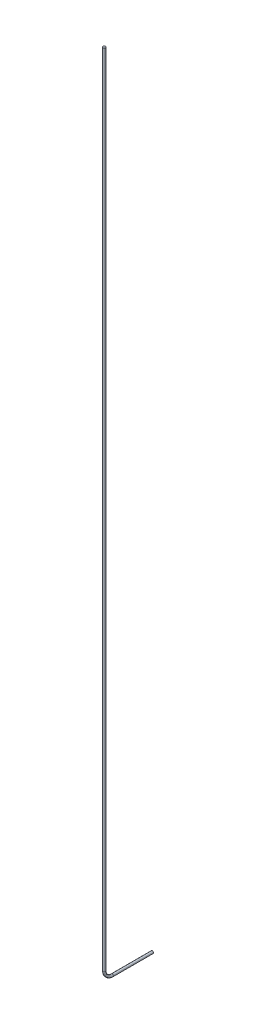
ISO-10303-21;
HEADER;
FILE_DESCRIPTION(('STEP AP214'),'2;1');
FILE_NAME('part.step','',(''),(''),'','','');
FILE_SCHEMA(('AUTOMOTIVE_DESIGN { 1 0 10303 214 1 1 1 1 }'));
ENDSEC;
DATA;
#1=APPLICATION_CONTEXT('core data for automotive mechanical design processes');
#2=APPLICATION_PROTOCOL_DEFINITION('international standard','automotive_design',2000,#1);
#3=PRODUCT_CONTEXT('',#1,'mechanical');
#4=PRODUCT('Part','Part','',(#3));
#5=PRODUCT_RELATED_PRODUCT_CATEGORY('part','',(#4));
#6=PRODUCT_DEFINITION_FORMATION('','',#4);
#7=PRODUCT_DEFINITION_CONTEXT('part definition',#1,'design');
#8=PRODUCT_DEFINITION('design','',#6,#7);
#9=PRODUCT_DEFINITION_SHAPE('','',#8);
#10=(LENGTH_UNIT() NAMED_UNIT(*) SI_UNIT(.MILLI.,.METRE.));
#11=(NAMED_UNIT(*) PLANE_ANGLE_UNIT() SI_UNIT($,.RADIAN.));
#12=(NAMED_UNIT(*) SI_UNIT($,.STERADIAN.) SOLID_ANGLE_UNIT());
#13=UNCERTAINTY_MEASURE_WITH_UNIT(LENGTH_MEASURE(1.E-05),#10,'distance_accuracy_value','');
#14=(GEOMETRIC_REPRESENTATION_CONTEXT(3) GLOBAL_UNCERTAINTY_ASSIGNED_CONTEXT((#13)) GLOBAL_UNIT_ASSIGNED_CONTEXT((#10,
#11,#12)) REPRESENTATION_CONTEXT('',''));
#15=CARTESIAN_POINT('',(0.,0.,0.));
#16=DIRECTION('',(0.,0.,1.));
#17=DIRECTION('',(1.,0.,0.));
#18=AXIS2_PLACEMENT_3D('',#15,#16,#17);
#19=CARTESIAN_POINT('',(0.,0.,20.));
#20=DIRECTION('',(0.,0.,-1.));
#21=DIRECTION('',(-1.,0.,0.));
#22=AXIS2_PLACEMENT_3D('',#19,#20,#21);
#23=CYLINDRICAL_SURFACE('',#22,0.75);
#24=CARTESIAN_POINT('',(0.,0.,0.));
#25=DIRECTION('',(0.,0.,1.));
#26=DIRECTION('',(1.,0.,0.));
#27=AXIS2_PLACEMENT_3D('',#24,#25,#26);
#28=CIRCLE('',#27,0.75);
#29=CARTESIAN_POINT('',(0.75,0.,0.));
#30=VERTEX_POINT('',#29);
#31=EDGE_CURVE('E10',#30,#30,#28,.T.);
#32=ORIENTED_EDGE('',*,*,#31,.T.);
#33=EDGE_LOOP('',(#32));
#34=FACE_BOUND('',#33,.T.);
#35=CARTESIAN_POINT('',(0.,0.,25.));
#36=DIRECTION('',(0.,0.,1.));
#37=DIRECTION('',(1.,0.,0.));
#38=AXIS2_PLACEMENT_3D('',#35,#36,#37);
#39=CIRCLE('',#38,0.75);
#40=CARTESIAN_POINT('',(0.,-0.749999999999837,25.));
#41=VERTEX_POINT('',#40);
#42=EDGE_CURVE('E56',#41,#41,#39,.T.);
#43=ORIENTED_EDGE('',*,*,#42,.F.);
#44=EDGE_LOOP('',(#43));
#45=FACE_BOUND('',#44,.T.);
#46=ADVANCED_FACE('F39',(#34,#45),#23,.T.);
#47=CARTESIAN_POINT('',(0.,0.,0.));
#48=DIRECTION('',(0.,0.,1.));
#49=DIRECTION('',(1.,0.,0.));
#50=AXIS2_PLACEMENT_3D('',#47,#48,#49);
#51=PLANE('',#50);
#52=ORIENTED_EDGE('',*,*,#31,.F.);
#53=EDGE_LOOP('',(#52));
#54=FACE_BOUND('',#53,.T.);
#55=ADVANCED_FACE('F66',(#54),#51,.F.);
#56=CARTESIAN_POINT('',(0.,505.,30.));
#57=DIRECTION('',(0.,1.,0.));
#58=DIRECTION('',(1.,0.,0.));
#59=AXIS2_PLACEMENT_3D('',#56,#57,#58);
#60=PLANE('',#59);
#61=CARTESIAN_POINT('',(0.,505.,30.));
#62=DIRECTION('',(0.,1.,0.));
#63=DIRECTION('',(1.,0.,0.));
#64=AXIS2_PLACEMENT_3D('',#61,#62,#63);
#65=CIRCLE('',#64,0.75);
#66=CARTESIAN_POINT('',(0.75,505.,30.));
#67=VERTEX_POINT('',#66);
#68=EDGE_CURVE('E46',#67,#67,#65,.T.);
#69=ORIENTED_EDGE('',*,*,#68,.T.);
#70=EDGE_LOOP('',(#69));
#71=FACE_BOUND('',#70,.T.);
#72=ADVANCED_FACE('F70',(#71),#60,.T.);
#73=CARTESIAN_POINT('',(0.,5.,25.));
#74=DIRECTION('',(-1.,0.,0.));
#75=DIRECTION('',(0.,0.,1.));
#76=AXIS2_PLACEMENT_3D('',#73,#74,#75);
#77=TOROIDAL_SURFACE('',#76,4.99999999999984,0.75);
#78=CARTESIAN_POINT('',(0.,5.,30.));
#79=DIRECTION('',(0.,1.,0.));
#80=DIRECTION('',(1.,0.,0.));
#81=AXIS2_PLACEMENT_3D('',#78,#79,#80);
#82=CIRCLE('',#81,0.75);
#83=CARTESIAN_POINT('',(0.,5.,30.7499999999998));
#84=VERTEX_POINT('',#83);
#85=EDGE_CURVE('E51',#84,#84,#82,.T.);
#86=CARTESIAN_POINT('',(0.,5.,25.));
#87=DIRECTION('',(-1.,0.,0.));
#88=DIRECTION('',(0.,0.,1.));
#89=AXIS2_PLACEMENT_3D('',#86,#87,#88);
#90=CIRCLE('',#89,5.74999999999984);
#91=EDGE_CURVE('',#41,#84,#90,.T.);
#92=ORIENTED_EDGE('',*,*,#42,.T.);
#93=ORIENTED_EDGE('',*,*,#85,.F.);
#94=ORIENTED_EDGE('',*,*,#91,.T.);
#95=ORIENTED_EDGE('',*,*,#91,.F.);
#96=EDGE_LOOP('',(#92,#94,#93,#95));
#97=FACE_BOUND('',#96,.T.);
#98=ADVANCED_FACE('F63',(#97),#77,.T.);
#99=CARTESIAN_POINT('',(0.,5.,30.));
#100=DIRECTION('',(0.,1.,0.));
#101=DIRECTION('',(0.,0.,1.));
#102=AXIS2_PLACEMENT_3D('',#99,#100,#101);
#103=CYLINDRICAL_SURFACE('',#102,0.75);
#104=ORIENTED_EDGE('',*,*,#68,.F.);
#105=EDGE_LOOP('',(#104));
#106=FACE_BOUND('',#105,.T.);
#107=ORIENTED_EDGE('',*,*,#85,.T.);
#108=EDGE_LOOP('',(#107));
#109=FACE_BOUND('',#108,.T.);
#110=ADVANCED_FACE('F72',(#106,#109),#103,.T.);
#111=CLOSED_SHELL('',(#46,#55,#72,#98,#110));
#112=MANIFOLD_SOLID_BREP('B2',#111);
#113=ADVANCED_BREP_SHAPE_REPRESENTATION('',(#18,#112),#14);
#114=SHAPE_DEFINITION_REPRESENTATION(#9,#113);
ENDSEC;
END-ISO-10303-21;
